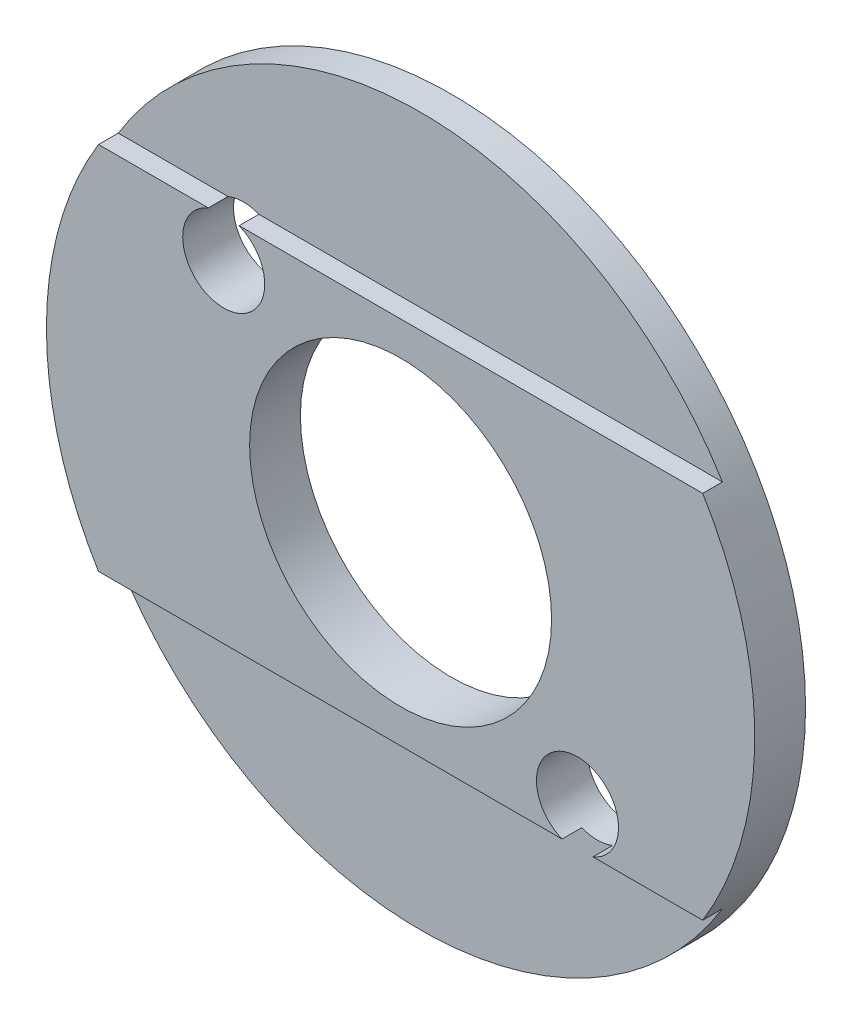
ISO-10303-21;
HEADER;
FILE_DESCRIPTION(('STEP AP214'),'2;1');
FILE_NAME('part.step','',(''),(''),'','','');
FILE_SCHEMA(('AUTOMOTIVE_DESIGN { 1 0 10303 214 1 1 1 1 }'));
ENDSEC;
DATA;
#1=APPLICATION_CONTEXT('core data for automotive mechanical design processes');
#2=APPLICATION_PROTOCOL_DEFINITION('international standard','automotive_design',2000,#1);
#3=PRODUCT_CONTEXT('',#1,'mechanical');
#4=PRODUCT('Part','Part','',(#3));
#5=PRODUCT_RELATED_PRODUCT_CATEGORY('part','',(#4));
#6=PRODUCT_DEFINITION_FORMATION('','',#4);
#7=PRODUCT_DEFINITION_CONTEXT('part definition',#1,'design');
#8=PRODUCT_DEFINITION('design','',#6,#7);
#9=PRODUCT_DEFINITION_SHAPE('','',#8);
#10=(LENGTH_UNIT() NAMED_UNIT(*) SI_UNIT(.MILLI.,.METRE.));
#11=(NAMED_UNIT(*) PLANE_ANGLE_UNIT() SI_UNIT($,.RADIAN.));
#12=(NAMED_UNIT(*) SI_UNIT($,.STERADIAN.) SOLID_ANGLE_UNIT());
#13=UNCERTAINTY_MEASURE_WITH_UNIT(LENGTH_MEASURE(1.E-05),#10,'distance_accuracy_value','');
#14=(GEOMETRIC_REPRESENTATION_CONTEXT(3) GLOBAL_UNCERTAINTY_ASSIGNED_CONTEXT((#13)) GLOBAL_UNIT_ASSIGNED_CONTEXT((#10,
#11,#12)) REPRESENTATION_CONTEXT('',''));
#15=CARTESIAN_POINT('',(0.,0.,0.));
#16=DIRECTION('',(0.,0.,1.));
#17=DIRECTION('',(1.,0.,0.));
#18=AXIS2_PLACEMENT_3D('',#15,#16,#17);
#19=CARTESIAN_POINT('',(-40.9421191471587,-66.3163915847635,1.5875));
#20=DIRECTION('',(0.,0.,-1.));
#21=DIRECTION('',(-1.,0.,0.));
#22=AXIS2_PLACEMENT_3D('',#19,#20,#21);
#23=CYLINDRICAL_SURFACE('',#22,3.3);
#24=DIRECTION('',(0.,0.,-1.));
#25=VECTOR('',#24,1.);
#26=CARTESIAN_POINT('',(-39.7011971356088,-63.2585962088021,1.5875));
#27=LINE('',#26,#25);
#28=CARTESIAN_POINT('',(-39.7011971356088,-63.2585962088021,1.5875));
#29=VERTEX_POINT('',#28);
#30=CARTESIAN_POINT('',(-39.7011971356088,-63.2585962088021,0.));
#31=VERTEX_POINT('',#30);
#32=EDGE_CURVE('E52',#29,#31,#27,.T.);
#33=ORIENTED_EDGE('',*,*,#32,.T.);
#34=CARTESIAN_POINT('',(-40.9421191471587,-66.3163915847635,0.));
#35=DIRECTION('',(0.,0.,-1.));
#36=DIRECTION('',(-1.,0.,0.));
#37=AXIS2_PLACEMENT_3D('',#34,#35,#36);
#38=CIRCLE('',#37,3.3);
#39=CARTESIAN_POINT('',(-42.1830411587086,-63.2585962088021,0.));
#40=VERTEX_POINT('',#39);
#41=EDGE_CURVE('E197',#31,#40,#38,.F.);
#42=ORIENTED_EDGE('',*,*,#41,.T.);
#43=DIRECTION('',(0.,0.,-1.));
#44=VECTOR('',#43,1.);
#45=CARTESIAN_POINT('',(-42.1830411587086,-63.2585962088021,1.5875));
#46=LINE('',#45,#44);
#47=CARTESIAN_POINT('',(-42.1830411587086,-63.2585962088021,1.5875));
#48=VERTEX_POINT('',#47);
#49=EDGE_CURVE('E11',#48,#40,#46,.T.);
#50=ORIENTED_EDGE('',*,*,#49,.F.);
#51=CARTESIAN_POINT('',(-40.9421191471587,-66.3163915847635,1.5875));
#52=DIRECTION('',(0.,0.,1.));
#53=DIRECTION('',(1.,0.,0.));
#54=AXIS2_PLACEMENT_3D('',#51,#52,#53);
#55=CIRCLE('',#54,3.3);
#56=EDGE_CURVE('E168',#48,#29,#55,.T.);
#57=ORIENTED_EDGE('',*,*,#56,.T.);
#58=EDGE_LOOP('',(#33,#42,#50,#57));
#59=FACE_BOUND('',#58,.T.);
#60=CARTESIAN_POINT('',(-40.9421191471587,-66.3163915847635,-2.5));
#61=DIRECTION('',(0.,0.,-1.));
#62=DIRECTION('',(-1.,0.,0.));
#63=AXIS2_PLACEMENT_3D('',#60,#61,#62);
#64=CIRCLE('',#63,3.3);
#65=CARTESIAN_POINT('',(-44.2421191471587,-66.3163915847635,-2.5));
#66=VERTEX_POINT('',#65);
#67=EDGE_CURVE('E155',#66,#66,#64,.F.);
#68=ORIENTED_EDGE('',*,*,#67,.F.);
#69=EDGE_LOOP('',(#68));
#70=FACE_BOUND('',#69,.T.);
#71=ADVANCED_FACE('F35',(#59,#70),#23,.F.);
#72=CARTESIAN_POINT('',(0.,-63.2585962088021,1.5875));
#73=DIRECTION('',(0.,1.,0.));
#74=DIRECTION('',(0.,0.,1.));
#75=AXIS2_PLACEMENT_3D('',#72,#73,#74);
#76=PLANE('',#75);
#77=DIRECTION('',(1.,0.,0.));
#78=VECTOR('',#77,1.);
#79=CARTESIAN_POINT('',(0.,-63.2585962088021,0.));
#80=LINE('',#79,#78);
#81=CARTESIAN_POINT('',(-51.018397575645,-63.2585962088021,0.));
#82=VERTEX_POINT('',#81);
#83=EDGE_CURVE('E146',#82,#40,#80,.T.);
#84=ORIENTED_EDGE('',*,*,#83,.F.);
#85=DIRECTION('',(0.,0.,-1.));
#86=VECTOR('',#85,1.);
#87=CARTESIAN_POINT('',(-51.018397575645,-63.2585962088021,1.5875));
#88=LINE('',#87,#86);
#89=CARTESIAN_POINT('',(-51.018397575645,-63.2585962088021,1.5875));
#90=VERTEX_POINT('',#89);
#91=EDGE_CURVE('E44',#90,#82,#88,.T.);
#92=ORIENTED_EDGE('',*,*,#91,.F.);
#93=DIRECTION('',(1.,0.,0.));
#94=VECTOR('',#93,1.);
#95=CARTESIAN_POINT('',(0.,-63.2585962088021,1.5875));
#96=LINE('',#95,#94);
#97=EDGE_CURVE('E170',#90,#48,#96,.T.);
#98=ORIENTED_EDGE('',*,*,#97,.T.);
#99=ORIENTED_EDGE('',*,*,#49,.T.);
#100=EDGE_LOOP('',(#84,#92,#98,#99));
#101=FACE_BOUND('',#100,.T.);
#102=ADVANCED_FACE('F147',(#101),#76,.T.);
#103=CARTESIAN_POINT('',(0.,-93.0085962088021,1.5875));
#104=DIRECTION('',(0.,1.,0.));
#105=DIRECTION('',(0.,0.,1.));
#106=AXIS2_PLACEMENT_3D('',#103,#104,#105);
#107=PLANE('',#106);
#108=DIRECTION('',(1.,0.,0.));
#109=VECTOR('',#108,1.);
#110=CARTESIAN_POINT('',(0.,-93.0085962088021,0.));
#111=LINE('',#110,#109);
#112=CARTESIAN_POINT('',(-51.018397575645,-93.0085962088021,0.));
#113=VERTEX_POINT('',#112);
#114=CARTESIAN_POINT('',(-13.7152576219738,-93.0085962088021,0.));
#115=VERTEX_POINT('',#114);
#116=EDGE_CURVE('E150',#113,#115,#111,.T.);
#117=ORIENTED_EDGE('',*,*,#116,.T.);
#118=DIRECTION('',(0.,0.,-1.));
#119=VECTOR('',#118,1.);
#120=CARTESIAN_POINT('',(-13.7152576219738,-93.0085962088021,1.5875));
#121=LINE('',#120,#119);
#122=CARTESIAN_POINT('',(-13.7152576219738,-93.0085962088021,1.5875));
#123=VERTEX_POINT('',#122);
#124=EDGE_CURVE('E129',#123,#115,#121,.T.);
#125=ORIENTED_EDGE('',*,*,#124,.F.);
#126=DIRECTION('',(1.,0.,0.));
#127=VECTOR('',#126,1.);
#128=CARTESIAN_POINT('',(0.,-93.0085962088021,1.5875));
#129=LINE('',#128,#127);
#130=CARTESIAN_POINT('',(-51.018397575645,-93.0085962088021,1.5875));
#131=VERTEX_POINT('',#130);
#132=EDGE_CURVE('E122',#131,#123,#129,.T.);
#133=ORIENTED_EDGE('',*,*,#132,.F.);
#134=DIRECTION('',(0.,0.,-1.));
#135=VECTOR('',#134,1.);
#136=CARTESIAN_POINT('',(-51.018397575645,-93.0085962088021,1.5875));
#137=LINE('',#136,#135);
#138=EDGE_CURVE('E135',#131,#113,#137,.T.);
#139=ORIENTED_EDGE('',*,*,#138,.T.);
#140=EDGE_LOOP('',(#117,#125,#133,#139));
#141=FACE_BOUND('',#140,.T.);
#142=ADVANCED_FACE('F207',(#141),#107,.F.);
#143=CARTESIAN_POINT('',(-12.4743356104237,-89.9508008328408,1.5875));
#144=DIRECTION('',(0.,0.,-1.));
#145=DIRECTION('',(-1.,0.,0.));
#146=AXIS2_PLACEMENT_3D('',#143,#144,#145);
#147=CYLINDRICAL_SURFACE('',#146,3.3);
#148=ORIENTED_EDGE('',*,*,#124,.T.);
#149=CARTESIAN_POINT('',(-12.4743356104237,-89.9508008328408,0.));
#150=DIRECTION('',(0.,0.,-1.));
#151=DIRECTION('',(-1.,0.,0.));
#152=AXIS2_PLACEMENT_3D('',#149,#150,#151);
#153=CIRCLE('',#152,3.3);
#154=CARTESIAN_POINT('',(-11.2334135988736,-93.0085962088021,0.));
#155=VERTEX_POINT('',#154);
#156=EDGE_CURVE('E161',#115,#155,#153,.F.);
#157=ORIENTED_EDGE('',*,*,#156,.T.);
#158=DIRECTION('',(0.,0.,-1.));
#159=VECTOR('',#158,1.);
#160=CARTESIAN_POINT('',(-11.2334135988736,-93.0085962088021,1.5875));
#161=LINE('',#160,#159);
#162=CARTESIAN_POINT('',(-11.2334135988736,-93.0085962088021,1.5875));
#163=VERTEX_POINT('',#162);
#164=EDGE_CURVE('E127',#163,#155,#161,.T.);
#165=ORIENTED_EDGE('',*,*,#164,.F.);
#166=CARTESIAN_POINT('',(-12.4743356104237,-89.9508008328408,1.5875));
#167=DIRECTION('',(0.,0.,1.));
#168=DIRECTION('',(1.,0.,0.));
#169=AXIS2_PLACEMENT_3D('',#166,#167,#168);
#170=CIRCLE('',#169,3.3);
#171=EDGE_CURVE('E119',#163,#123,#170,.T.);
#172=ORIENTED_EDGE('',*,*,#171,.T.);
#173=EDGE_LOOP('',(#148,#157,#165,#172));
#174=FACE_BOUND('',#173,.T.);
#175=CARTESIAN_POINT('',(-12.4743356104237,-89.9508008328408,-2.5));
#176=DIRECTION('',(0.,0.,-1.));
#177=DIRECTION('',(-1.,0.,0.));
#178=AXIS2_PLACEMENT_3D('',#175,#176,#177);
#179=CIRCLE('',#178,3.3);
#180=CARTESIAN_POINT('',(-15.7743356104237,-89.9508008328408,-2.5));
#181=VERTEX_POINT('',#180);
#182=EDGE_CURVE('E159',#181,#181,#179,.F.);
#183=ORIENTED_EDGE('',*,*,#182,.F.);
#184=EDGE_LOOP('',(#183));
#185=FACE_BOUND('',#184,.T.);
#186=ADVANCED_FACE('F201',(#174,#185),#147,.F.);
#187=CARTESIAN_POINT('',(-2.39805718193734,-93.0085962088021,0.));
#188=VERTEX_POINT('',#187);
#189=EDGE_CURVE('E125',#155,#188,#111,.T.);
#190=ORIENTED_EDGE('',*,*,#189,.T.);
#191=DIRECTION('',(0.,0.,-1.));
#192=VECTOR('',#191,1.);
#193=CARTESIAN_POINT('',(-2.39805718193734,-93.0085962088021,1.5875));
#194=LINE('',#193,#192);
#195=CARTESIAN_POINT('',(-2.39805718193734,-93.0085962088021,1.5875));
#196=VERTEX_POINT('',#195);
#197=EDGE_CURVE('E106',#196,#188,#194,.T.);
#198=ORIENTED_EDGE('',*,*,#197,.F.);
#199=EDGE_CURVE('E112',#163,#196,#129,.T.);
#200=ORIENTED_EDGE('',*,*,#199,.F.);
#201=ORIENTED_EDGE('',*,*,#164,.T.);
#202=EDGE_LOOP('',(#190,#198,#200,#201));
#203=FACE_BOUND('',#202,.T.);
#204=ADVANCED_FACE('F123',(#203),#107,.F.);
#205=CARTESIAN_POINT('',(-26.7082273787912,-78.1335962088021,1.5875));
#206=DIRECTION('',(0.,0.,-1.));
#207=DIRECTION('',(-1.,0.,0.));
#208=AXIS2_PLACEMENT_3D('',#205,#206,#207);
#209=CYLINDRICAL_SURFACE('',#208,28.5);
#210=ORIENTED_EDGE('',*,*,#197,.T.);
#211=CARTESIAN_POINT('',(-26.7082273787912,-78.1335962088021,0.));
#212=DIRECTION('',(0.,0.,-1.));
#213=DIRECTION('',(-1.,0.,0.));
#214=AXIS2_PLACEMENT_3D('',#211,#212,#213);
#215=CIRCLE('',#214,28.5);
#216=EDGE_CURVE('E156',#188,#113,#215,.T.);
#217=ORIENTED_EDGE('',*,*,#216,.T.);
#218=ORIENTED_EDGE('',*,*,#138,.F.);
#219=CARTESIAN_POINT('',(-26.7082273787912,-78.1335962088021,1.5875));
#220=DIRECTION('',(0.,0.,1.));
#221=DIRECTION('',(1.,0.,0.));
#222=AXIS2_PLACEMENT_3D('',#219,#220,#221);
#223=CIRCLE('',#222,28.5);
#224=EDGE_CURVE('E114',#90,#131,#223,.T.);
#225=ORIENTED_EDGE('',*,*,#224,.F.);
#226=ORIENTED_EDGE('',*,*,#91,.T.);
#227=CARTESIAN_POINT('',(-2.39805718193739,-63.2585962088021,0.));
#228=VERTEX_POINT('',#227);
#229=EDGE_CURVE('E139',#82,#228,#215,.T.);
#230=ORIENTED_EDGE('',*,*,#229,.T.);
#231=DIRECTION('',(0.,0.,-1.));
#232=VECTOR('',#231,1.);
#233=CARTESIAN_POINT('',(-2.39805718193739,-63.2585962088021,1.5875));
#234=LINE('',#233,#232);
#235=CARTESIAN_POINT('',(-2.39805718193739,-63.2585962088021,1.5875));
#236=VERTEX_POINT('',#235);
#237=EDGE_CURVE('E77',#236,#228,#234,.T.);
#238=ORIENTED_EDGE('',*,*,#237,.F.);
#239=EDGE_CURVE('E100',#196,#236,#223,.T.);
#240=ORIENTED_EDGE('',*,*,#239,.F.);
#241=EDGE_LOOP('',(#210,#217,#218,#225,#226,#230,#238,#240));
#242=FACE_BOUND('',#241,.T.);
#243=CARTESIAN_POINT('',(-26.7082273787912,-78.1335962088021,-2.5));
#244=DIRECTION('',(0.,0.,-1.));
#245=DIRECTION('',(-1.,0.,0.));
#246=AXIS2_PLACEMENT_3D('',#243,#244,#245);
#247=CIRCLE('',#246,28.5);
#248=CARTESIAN_POINT('',(-55.2082273787912,-78.1335962088021,-2.5));
#249=VERTEX_POINT('',#248);
#250=EDGE_CURVE('E190',#249,#249,#247,.T.);
#251=ORIENTED_EDGE('',*,*,#250,.F.);
#252=EDGE_LOOP('',(#251));
#253=FACE_BOUND('',#252,.T.);
#254=ADVANCED_FACE('F102',(#242,#253),#209,.T.);
#255=CARTESIAN_POINT('',(-26.7082273787912,-78.1335962088021,1.5875));
#256=DIRECTION('',(0.,0.,-1.));
#257=DIRECTION('',(-1.,0.,0.));
#258=AXIS2_PLACEMENT_3D('',#255,#256,#257);
#259=CYLINDRICAL_SURFACE('',#258,12.15);
#260=CARTESIAN_POINT('',(-26.7082273787912,-78.1335962088021,1.5875));
#261=DIRECTION('',(0.,0.,1.));
#262=DIRECTION('',(1.,0.,0.));
#263=AXIS2_PLACEMENT_3D('',#260,#261,#262);
#264=CIRCLE('',#263,12.15);
#265=CARTESIAN_POINT('',(-14.5582273787912,-78.1335962088021,1.5875));
#266=VERTEX_POINT('',#265);
#267=EDGE_CURVE('E165',#266,#266,#264,.T.);
#268=ORIENTED_EDGE('',*,*,#267,.T.);
#269=EDGE_LOOP('',(#268));
#270=FACE_BOUND('',#269,.T.);
#271=CARTESIAN_POINT('',(-26.7082273787912,-78.1335962088021,-2.5));
#272=DIRECTION('',(0.,0.,-1.));
#273=DIRECTION('',(-1.,0.,0.));
#274=AXIS2_PLACEMENT_3D('',#271,#272,#273);
#275=CIRCLE('',#274,12.15);
#276=CARTESIAN_POINT('',(-38.8582273787912,-78.1335962088021,-2.5));
#277=VERTEX_POINT('',#276);
#278=EDGE_CURVE('E151',#277,#277,#275,.F.);
#279=ORIENTED_EDGE('',*,*,#278,.F.);
#280=EDGE_LOOP('',(#279));
#281=FACE_BOUND('',#280,.T.);
#282=ADVANCED_FACE('F37',(#270,#281),#259,.F.);
#283=EDGE_CURVE('E153',#31,#228,#80,.T.);
#284=ORIENTED_EDGE('',*,*,#283,.F.);
#285=ORIENTED_EDGE('',*,*,#32,.F.);
#286=EDGE_CURVE('E111',#29,#236,#96,.T.);
#287=ORIENTED_EDGE('',*,*,#286,.T.);
#288=ORIENTED_EDGE('',*,*,#237,.T.);
#289=EDGE_LOOP('',(#284,#285,#287,#288));
#290=FACE_BOUND('',#289,.T.);
#291=ADVANCED_FACE('F174',(#290),#76,.T.);
#292=CARTESIAN_POINT('',(0.,0.,1.5875));
#293=DIRECTION('',(0.,0.,1.));
#294=DIRECTION('',(1.,0.,0.));
#295=AXIS2_PLACEMENT_3D('',#292,#293,#294);
#296=PLANE('',#295);
#297=ORIENTED_EDGE('',*,*,#267,.F.);
#298=EDGE_LOOP('',(#297));
#299=FACE_BOUND('',#298,.T.);
#300=ORIENTED_EDGE('',*,*,#56,.F.);
#301=ORIENTED_EDGE('',*,*,#97,.F.);
#302=ORIENTED_EDGE('',*,*,#224,.T.);
#303=ORIENTED_EDGE('',*,*,#132,.T.);
#304=ORIENTED_EDGE('',*,*,#171,.F.);
#305=ORIENTED_EDGE('',*,*,#199,.T.);
#306=ORIENTED_EDGE('',*,*,#239,.T.);
#307=ORIENTED_EDGE('',*,*,#286,.F.);
#308=EDGE_LOOP('',(#300,#301,#302,#303,#304,#305,#306,#307));
#309=FACE_BOUND('',#308,.T.);
#310=ADVANCED_FACE('F117',(#299,#309),#296,.T.);
#311=CARTESIAN_POINT('',(0.,0.,0.));
#312=DIRECTION('',(0.,0.,-1.));
#313=DIRECTION('',(-1.,0.,0.));
#314=AXIS2_PLACEMENT_3D('',#311,#312,#313);
#315=PLANE('',#314);
#316=ORIENTED_EDGE('',*,*,#41,.F.);
#317=ORIENTED_EDGE('',*,*,#283,.T.);
#318=ORIENTED_EDGE('',*,*,#229,.F.);
#319=ORIENTED_EDGE('',*,*,#83,.T.);
#320=EDGE_LOOP('',(#316,#317,#318,#319));
#321=FACE_BOUND('',#320,.T.);
#322=ADVANCED_FACE('F154',(#321),#315,.F.);
#323=CARTESIAN_POINT('',(0.,0.,-2.5));
#324=DIRECTION('',(0.,0.,-1.));
#325=DIRECTION('',(-1.,0.,0.));
#326=AXIS2_PLACEMENT_3D('',#323,#324,#325);
#327=PLANE('',#326);
#328=ORIENTED_EDGE('',*,*,#67,.T.);
#329=EDGE_LOOP('',(#328));
#330=FACE_BOUND('',#329,.T.);
#331=ORIENTED_EDGE('',*,*,#182,.T.);
#332=EDGE_LOOP('',(#331));
#333=FACE_BOUND('',#332,.T.);
#334=ORIENTED_EDGE('',*,*,#250,.T.);
#335=EDGE_LOOP('',(#334));
#336=FACE_BOUND('',#335,.T.);
#337=ORIENTED_EDGE('',*,*,#278,.T.);
#338=EDGE_LOOP('',(#337));
#339=FACE_BOUND('',#338,.T.);
#340=ADVANCED_FACE('F179',(#330,#333,#336,#339),#327,.T.);
#341=ORIENTED_EDGE('',*,*,#189,.F.);
#342=ORIENTED_EDGE('',*,*,#156,.F.);
#343=ORIENTED_EDGE('',*,*,#116,.F.);
#344=ORIENTED_EDGE('',*,*,#216,.F.);
#345=EDGE_LOOP('',(#341,#342,#343,#344));
#346=FACE_BOUND('',#345,.T.);
#347=ADVANCED_FACE('F182',(#346),#315,.F.);
#348=CLOSED_SHELL('',(#71,#102,#142,#186,#204,#254,#282,#291,#310,#322,#340,#347));
#349=MANIFOLD_SOLID_BREP('B2',#348);
#350=ADVANCED_BREP_SHAPE_REPRESENTATION('',(#18,#349),#14);
#351=SHAPE_DEFINITION_REPRESENTATION(#9,#350);
ENDSEC;
END-ISO-10303-21;
